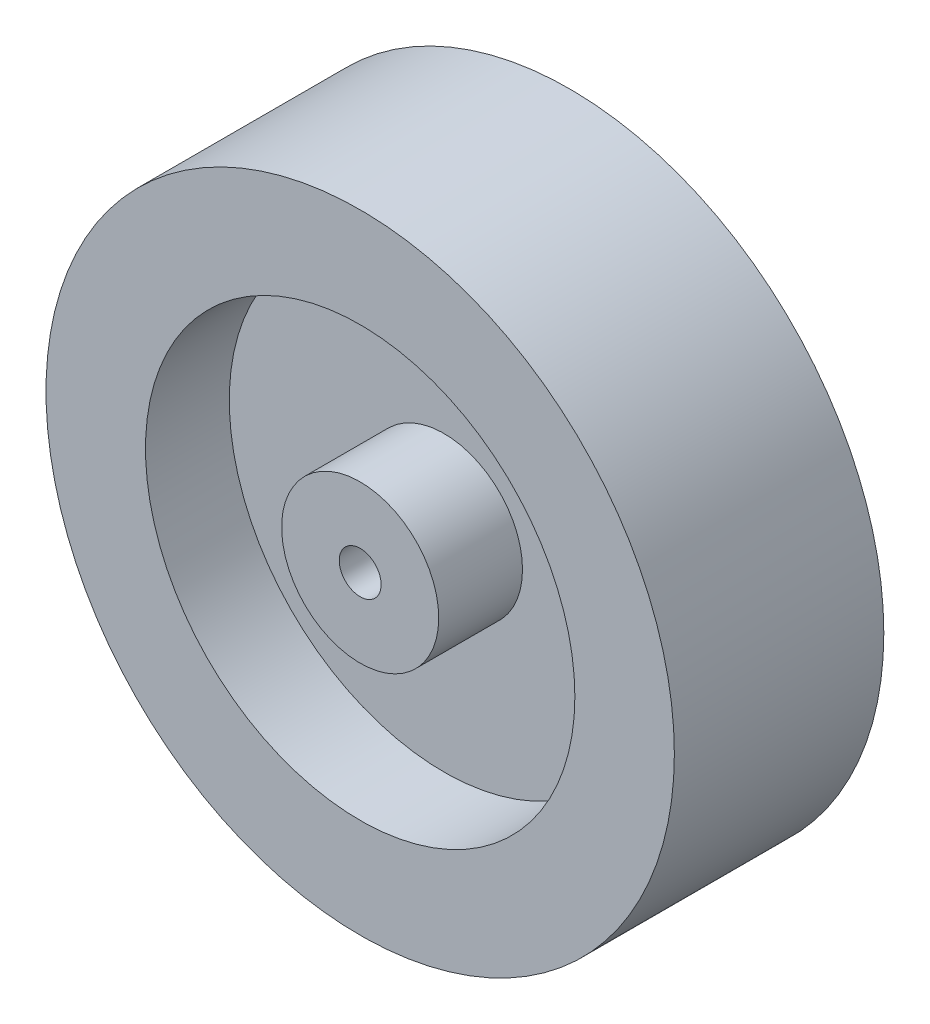
ISO-10303-21;
HEADER;
FILE_DESCRIPTION(('STEP AP214'),'2;1');
FILE_NAME('part.step','',(''),(''),'','','');
FILE_SCHEMA(('AUTOMOTIVE_DESIGN { 1 0 10303 214 1 1 1 1 }'));
ENDSEC;
DATA;
#1=APPLICATION_CONTEXT('core data for automotive mechanical design processes');
#2=APPLICATION_PROTOCOL_DEFINITION('international standard','automotive_design',2000,#1);
#3=PRODUCT_CONTEXT('',#1,'mechanical');
#4=PRODUCT('Part','Part','',(#3));
#5=PRODUCT_RELATED_PRODUCT_CATEGORY('part','',(#4));
#6=PRODUCT_DEFINITION_FORMATION('','',#4);
#7=PRODUCT_DEFINITION_CONTEXT('part definition',#1,'design');
#8=PRODUCT_DEFINITION('design','',#6,#7);
#9=PRODUCT_DEFINITION_SHAPE('','',#8);
#10=(LENGTH_UNIT() NAMED_UNIT(*) SI_UNIT(.MILLI.,.METRE.));
#11=(NAMED_UNIT(*) PLANE_ANGLE_UNIT() SI_UNIT($,.RADIAN.));
#12=(NAMED_UNIT(*) SI_UNIT($,.STERADIAN.) SOLID_ANGLE_UNIT());
#13=UNCERTAINTY_MEASURE_WITH_UNIT(LENGTH_MEASURE(1.E-05),#10,'distance_accuracy_value','');
#14=(GEOMETRIC_REPRESENTATION_CONTEXT(3) GLOBAL_UNCERTAINTY_ASSIGNED_CONTEXT((#13)) GLOBAL_UNIT_ASSIGNED_CONTEXT((#10,
#11,#12)) REPRESENTATION_CONTEXT('',''));
#15=CARTESIAN_POINT('',(0.,0.,0.));
#16=DIRECTION('',(0.,0.,1.));
#17=DIRECTION('',(1.,0.,0.));
#18=AXIS2_PLACEMENT_3D('',#15,#16,#17);
#19=CARTESIAN_POINT('',(0.,0.,10.));
#20=DIRECTION('',(0.,0.,1.));
#21=DIRECTION('',(1.,0.,0.));
#22=AXIS2_PLACEMENT_3D('',#19,#20,#21);
#23=PLANE('',#22);
#24=CARTESIAN_POINT('',(0.,0.,10.));
#25=DIRECTION('',(0.,0.,1.));
#26=DIRECTION('',(1.,0.,0.));
#27=AXIS2_PLACEMENT_3D('',#24,#25,#26);
#28=CIRCLE('',#27,1.);
#29=CARTESIAN_POINT('',(1.,0.,10.));
#30=VERTEX_POINT('',#29);
#31=EDGE_CURVE('E41',#30,#30,#28,.T.);
#32=ORIENTED_EDGE('',*,*,#31,.F.);
#33=EDGE_LOOP('',(#32));
#34=FACE_BOUND('',#33,.T.);
#35=CARTESIAN_POINT('',(0.,0.,10.));
#36=DIRECTION('',(0.,0.,1.));
#37=DIRECTION('',(1.,0.,0.));
#38=AXIS2_PLACEMENT_3D('',#35,#36,#37);
#39=CIRCLE('',#38,3.75);
#40=CARTESIAN_POINT('',(3.75,0.,10.));
#41=VERTEX_POINT('',#40);
#42=EDGE_CURVE('E55',#41,#41,#39,.T.);
#43=ORIENTED_EDGE('',*,*,#42,.T.);
#44=EDGE_LOOP('',(#43));
#45=FACE_BOUND('',#44,.T.);
#46=ADVANCED_FACE('F30',(#34,#45),#23,.T.);
#47=CARTESIAN_POINT('',(0.,0.,10.));
#48=DIRECTION('',(0.,0.,1.));
#49=DIRECTION('',(1.,0.,0.));
#50=AXIS2_PLACEMENT_3D('',#47,#48,#49);
#51=CIRCLE('',#50,10.25);
#52=CARTESIAN_POINT('',(10.25,0.,10.));
#53=VERTEX_POINT('',#52);
#54=EDGE_CURVE('E49',#53,#53,#51,.T.);
#55=ORIENTED_EDGE('',*,*,#54,.F.);
#56=EDGE_LOOP('',(#55));
#57=FACE_BOUND('',#56,.T.);
#58=CARTESIAN_POINT('',(0.,0.,10.));
#59=DIRECTION('',(0.,0.,1.));
#60=DIRECTION('',(1.,0.,0.));
#61=AXIS2_PLACEMENT_3D('',#58,#59,#60);
#62=CIRCLE('',#61,15.);
#63=CARTESIAN_POINT('',(15.,0.,10.));
#64=VERTEX_POINT('',#63);
#65=EDGE_CURVE('E10',#64,#64,#62,.T.);
#66=ORIENTED_EDGE('',*,*,#65,.T.);
#67=EDGE_LOOP('',(#66));
#68=FACE_BOUND('',#67,.T.);
#69=ADVANCED_FACE('F77',(#57,#68),#23,.T.);
#70=CARTESIAN_POINT('',(0.,0.,0.));
#71=DIRECTION('',(0.,0.,1.));
#72=DIRECTION('',(1.,0.,0.));
#73=AXIS2_PLACEMENT_3D('',#70,#71,#72);
#74=PLANE('',#73);
#75=CARTESIAN_POINT('',(0.,0.,0.));
#76=DIRECTION('',(0.,0.,1.));
#77=DIRECTION('',(1.,0.,0.));
#78=AXIS2_PLACEMENT_3D('',#75,#76,#77);
#79=CIRCLE('',#78,15.);
#80=CARTESIAN_POINT('',(15.,0.,0.));
#81=VERTEX_POINT('',#80);
#82=EDGE_CURVE('E34',#81,#81,#79,.T.);
#83=ORIENTED_EDGE('',*,*,#82,.F.);
#84=EDGE_LOOP('',(#83));
#85=FACE_BOUND('',#84,.T.);
#86=CARTESIAN_POINT('',(0.,0.,0.));
#87=DIRECTION('',(0.,0.,1.));
#88=DIRECTION('',(1.,0.,0.));
#89=AXIS2_PLACEMENT_3D('',#86,#87,#88);
#90=CIRCLE('',#89,1.);
#91=CARTESIAN_POINT('',(1.,0.,0.));
#92=VERTEX_POINT('',#91);
#93=EDGE_CURVE('E43',#92,#92,#90,.T.);
#94=ORIENTED_EDGE('',*,*,#93,.T.);
#95=EDGE_LOOP('',(#94));
#96=FACE_BOUND('',#95,.T.);
#97=ADVANCED_FACE('F79',(#85,#96),#74,.F.);
#98=CARTESIAN_POINT('',(0.,0.,10.));
#99=DIRECTION('',(0.,0.,-1.));
#100=DIRECTION('',(-1.,0.,0.));
#101=AXIS2_PLACEMENT_3D('',#98,#99,#100);
#102=CYLINDRICAL_SURFACE('',#101,15.);
#103=ORIENTED_EDGE('',*,*,#65,.F.);
#104=EDGE_LOOP('',(#103));
#105=FACE_BOUND('',#104,.T.);
#106=ORIENTED_EDGE('',*,*,#82,.T.);
#107=EDGE_LOOP('',(#106));
#108=FACE_BOUND('',#107,.T.);
#109=ADVANCED_FACE('F32',(#105,#108),#102,.T.);
#110=CARTESIAN_POINT('',(0.,0.,10.));
#111=DIRECTION('',(0.,0.,-1.));
#112=DIRECTION('',(-1.,0.,0.));
#113=AXIS2_PLACEMENT_3D('',#110,#111,#112);
#114=CYLINDRICAL_SURFACE('',#113,1.);
#115=ORIENTED_EDGE('',*,*,#31,.T.);
#116=EDGE_LOOP('',(#115));
#117=FACE_BOUND('',#116,.T.);
#118=ORIENTED_EDGE('',*,*,#93,.F.);
#119=EDGE_LOOP('',(#118));
#120=FACE_BOUND('',#119,.T.);
#121=ADVANCED_FACE('F73',(#117,#120),#114,.F.);
#122=CARTESIAN_POINT('',(0.,0.,6.));
#123=DIRECTION('',(0.,0.,1.));
#124=DIRECTION('',(1.,0.,0.));
#125=AXIS2_PLACEMENT_3D('',#122,#123,#124);
#126=CYLINDRICAL_SURFACE('',#125,10.25);
#127=CARTESIAN_POINT('',(0.,0.,6.));
#128=DIRECTION('',(0.,0.,1.));
#129=DIRECTION('',(1.,0.,0.));
#130=AXIS2_PLACEMENT_3D('',#127,#128,#129);
#131=CIRCLE('',#130,10.25);
#132=CARTESIAN_POINT('',(10.25,0.,6.));
#133=VERTEX_POINT('',#132);
#134=EDGE_CURVE('E46',#133,#133,#131,.T.);
#135=ORIENTED_EDGE('',*,*,#134,.F.);
#136=EDGE_LOOP('',(#135));
#137=FACE_BOUND('',#136,.T.);
#138=ORIENTED_EDGE('',*,*,#54,.T.);
#139=EDGE_LOOP('',(#138));
#140=FACE_BOUND('',#139,.T.);
#141=ADVANCED_FACE('F67',(#137,#140),#126,.F.);
#142=CARTESIAN_POINT('',(0.,0.,6.));
#143=DIRECTION('',(0.,0.,1.));
#144=DIRECTION('',(1.,0.,0.));
#145=AXIS2_PLACEMENT_3D('',#142,#143,#144);
#146=PLANE('',#145);
#147=CARTESIAN_POINT('',(0.,0.,6.));
#148=DIRECTION('',(0.,0.,1.));
#149=DIRECTION('',(1.,0.,0.));
#150=AXIS2_PLACEMENT_3D('',#147,#148,#149);
#151=CIRCLE('',#150,3.75);
#152=CARTESIAN_POINT('',(3.75,0.,6.));
#153=VERTEX_POINT('',#152);
#154=EDGE_CURVE('E52',#153,#153,#151,.T.);
#155=ORIENTED_EDGE('',*,*,#154,.F.);
#156=EDGE_LOOP('',(#155));
#157=FACE_BOUND('',#156,.T.);
#158=ORIENTED_EDGE('',*,*,#134,.T.);
#159=EDGE_LOOP('',(#158));
#160=FACE_BOUND('',#159,.T.);
#161=ADVANCED_FACE('F64',(#157,#160),#146,.T.);
#162=CARTESIAN_POINT('',(0.,0.,6.));
#163=DIRECTION('',(0.,0.,1.));
#164=DIRECTION('',(1.,0.,0.));
#165=AXIS2_PLACEMENT_3D('',#162,#163,#164);
#166=CYLINDRICAL_SURFACE('',#165,3.75);
#167=ORIENTED_EDGE('',*,*,#154,.T.);
#168=EDGE_LOOP('',(#167));
#169=FACE_BOUND('',#168,.T.);
#170=ORIENTED_EDGE('',*,*,#42,.F.);
#171=EDGE_LOOP('',(#170));
#172=FACE_BOUND('',#171,.T.);
#173=ADVANCED_FACE('F61',(#169,#172),#166,.T.);
#174=CLOSED_SHELL('',(#46,#69,#97,#109,#121,#141,#161,#173));
#175=MANIFOLD_SOLID_BREP('B2',#174);
#176=ADVANCED_BREP_SHAPE_REPRESENTATION('',(#18,#175),#14);
#177=SHAPE_DEFINITION_REPRESENTATION(#9,#176);
ENDSEC;
END-ISO-10303-21;
